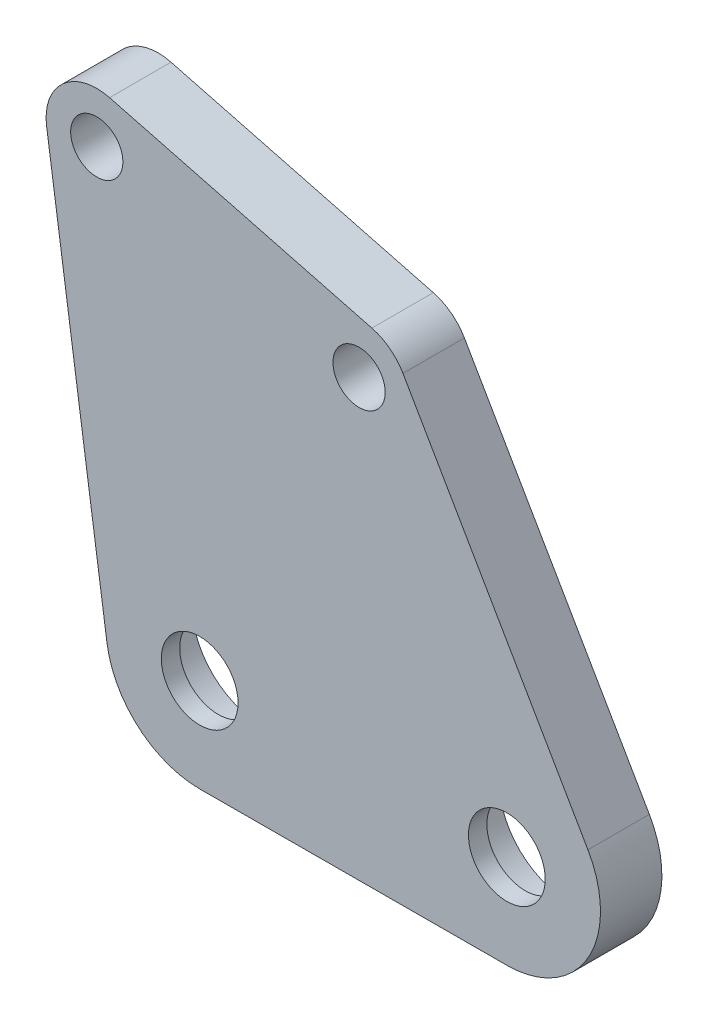
ISO-10303-21;
HEADER;
FILE_DESCRIPTION(('STEP AP214'),'2;1');
FILE_NAME('part.step','',(''),(''),'','','');
FILE_SCHEMA(('AUTOMOTIVE_DESIGN { 1 0 10303 214 1 1 1 1 }'));
ENDSEC;
DATA;
#1=APPLICATION_CONTEXT('core data for automotive mechanical design processes');
#2=APPLICATION_PROTOCOL_DEFINITION('international standard','automotive_design',2000,#1);
#3=PRODUCT_CONTEXT('',#1,'mechanical');
#4=PRODUCT('Part','Part','',(#3));
#5=PRODUCT_RELATED_PRODUCT_CATEGORY('part','',(#4));
#6=PRODUCT_DEFINITION_FORMATION('','',#4);
#7=PRODUCT_DEFINITION_CONTEXT('part definition',#1,'design');
#8=PRODUCT_DEFINITION('design','',#6,#7);
#9=PRODUCT_DEFINITION_SHAPE('','',#8);
#10=(LENGTH_UNIT() NAMED_UNIT(*) SI_UNIT(.MILLI.,.METRE.));
#11=(NAMED_UNIT(*) PLANE_ANGLE_UNIT() SI_UNIT($,.RADIAN.));
#12=(NAMED_UNIT(*) SI_UNIT($,.STERADIAN.) SOLID_ANGLE_UNIT());
#13=UNCERTAINTY_MEASURE_WITH_UNIT(LENGTH_MEASURE(1.E-05),#10,'distance_accuracy_value','');
#14=(GEOMETRIC_REPRESENTATION_CONTEXT(3) GLOBAL_UNCERTAINTY_ASSIGNED_CONTEXT((#13)) GLOBAL_UNIT_ASSIGNED_CONTEXT((#10,
#11,#12)) REPRESENTATION_CONTEXT('',''));
#15=CARTESIAN_POINT('',(0.,0.,0.));
#16=DIRECTION('',(0.,0.,1.));
#17=DIRECTION('',(1.,0.,0.));
#18=AXIS2_PLACEMENT_3D('',#15,#16,#17);
#19=CARTESIAN_POINT('',(-2.67855934400902,-10.2669661090581,10.));
#20=DIRECTION('',(0.252441341619206,0.967612199717167,0.));
#21=DIRECTION('',(-0.967612199717167,0.252441341619206,0.));
#22=AXIS2_PLACEMENT_3D('',#19,#20,#21);
#23=PLANE('',#22);
#24=DIRECTION('',(0.967612199717167,-0.252441341619206,0.));
#25=VECTOR('',#24,1.);
#26=CARTESIAN_POINT('',(-2.67855934400902,-10.2669661090581,0.));
#27=LINE('',#26,#25);
#28=CARTESIAN_POINT('',(22.0592937142197,-16.720850027247,0.));
#29=VERTEX_POINT('',#28);
#30=CARTESIAN_POINT('',(64.7586161350334,-27.8607201542379,0.));
#31=VERTEX_POINT('',#30);
#32=EDGE_CURVE('E144',#29,#31,#27,.T.);
#33=ORIENTED_EDGE('',*,*,#32,.F.);
#34=DIRECTION('',(0.,0.,-1.));
#35=VECTOR('',#34,1.);
#36=CARTESIAN_POINT('',(22.0592937142197,-16.720850027247,10.));
#37=LINE('',#36,#35);
#38=CARTESIAN_POINT('',(22.0592937142197,-16.720850027247,10.));
#39=VERTEX_POINT('',#38);
#40=EDGE_CURVE('E11',#39,#29,#37,.T.);
#41=ORIENTED_EDGE('',*,*,#40,.F.);
#42=DIRECTION('',(0.967612199717167,-0.252441341619206,0.));
#43=VECTOR('',#42,1.);
#44=CARTESIAN_POINT('',(-2.67855934400902,-10.2669661090581,10.));
#45=LINE('',#44,#43);
#46=CARTESIAN_POINT('',(64.7586161350334,-27.8607201542379,10.));
#47=VERTEX_POINT('',#46);
#48=EDGE_CURVE('E170',#39,#47,#45,.T.);
#49=ORIENTED_EDGE('',*,*,#48,.T.);
#50=DIRECTION('',(0.,0.,-1.));
#51=VECTOR('',#50,1.);
#52=CARTESIAN_POINT('',(64.7586161350334,-27.8607201542379,10.));
#53=LINE('',#52,#51);
#54=EDGE_CURVE('E88',#47,#31,#53,.T.);
#55=ORIENTED_EDGE('',*,*,#54,.T.);
#56=EDGE_LOOP('',(#33,#41,#49,#55));
#57=FACE_BOUND('',#56,.T.);
#58=ADVANCED_FACE('F36',(#57),#23,.T.);
#59=CARTESIAN_POINT('',(19.9766526458613,-24.7036506749136,10.));
#60=DIRECTION('',(0.,0.,-1.));
#61=DIRECTION('',(-1.,0.,0.));
#62=AXIS2_PLACEMENT_3D('',#59,#60,#61);
#63=CYLINDRICAL_SURFACE('',#62,8.25);
#64=CARTESIAN_POINT('',(19.9766526458613,-24.7036506749136,0.));
#65=DIRECTION('',(0.,0.,1.));
#66=DIRECTION('',(1.,0.,0.));
#67=AXIS2_PLACEMENT_3D('',#64,#65,#66);
#68=CIRCLE('',#67,8.25);
#69=CARTESIAN_POINT('',(11.811660920216,-25.8849254609581,0.));
#70=VERTEX_POINT('',#69);
#71=EDGE_CURVE('E147',#29,#70,#68,.T.);
#72=ORIENTED_EDGE('',*,*,#71,.T.);
#73=DIRECTION('',(0.,0.,-1.));
#74=VECTOR('',#73,1.);
#75=CARTESIAN_POINT('',(11.811660920216,-25.8849254609581,10.));
#76=LINE('',#75,#74);
#77=CARTESIAN_POINT('',(11.811660920216,-25.8849254609581,10.));
#78=VERTEX_POINT('',#77);
#79=EDGE_CURVE('E45',#78,#70,#76,.T.);
#80=ORIENTED_EDGE('',*,*,#79,.F.);
#81=CARTESIAN_POINT('',(19.9766526458613,-24.7036506749136,10.));
#82=DIRECTION('',(0.,0.,1.));
#83=DIRECTION('',(1.,0.,0.));
#84=AXIS2_PLACEMENT_3D('',#81,#82,#83);
#85=CIRCLE('',#84,8.25);
#86=EDGE_CURVE('E199',#39,#78,#85,.T.);
#87=ORIENTED_EDGE('',*,*,#86,.F.);
#88=ORIENTED_EDGE('',*,*,#40,.T.);
#89=EDGE_LOOP('',(#72,#80,#87,#88));
#90=FACE_BOUND('',#89,.T.);
#91=ADVANCED_FACE('F218',(#90),#63,.T.);
#92=CARTESIAN_POINT('',(7.90136117987293,1.14313388804774,10.));
#93=DIRECTION('',(-0.98969596674488,-0.143184822550845,0.));
#94=DIRECTION('',(0.143184822550845,-0.98969596674488,0.));
#95=AXIS2_PLACEMENT_3D('',#92,#93,#94);
#96=PLANE('',#95);
#97=DIRECTION('',(-0.143184822550845,0.98969596674488,0.));
#98=VECTOR('',#97,1.);
#99=CARTESIAN_POINT('',(7.90136117987293,1.14313388804774,0.));
#100=LINE('',#99,#98);
#101=CARTESIAN_POINT('',(21.6339845286062,-93.7769959060279,0.));
#102=VERTEX_POINT('',#101);
#103=EDGE_CURVE('E150',#102,#70,#100,.T.);
#104=ORIENTED_EDGE('',*,*,#103,.F.);
#105=DIRECTION('',(0.,0.,-1.));
#106=VECTOR('',#105,1.);
#107=CARTESIAN_POINT('',(21.6339845286062,-93.7769959060279,10.));
#108=LINE('',#107,#106);
#109=CARTESIAN_POINT('',(21.6339845286062,-93.7769959060279,10.));
#110=VERTEX_POINT('',#109);
#111=EDGE_CURVE('E176',#110,#102,#108,.T.);
#112=ORIENTED_EDGE('',*,*,#111,.F.);
#113=DIRECTION('',(-0.143184822550845,0.98969596674488,0.));
#114=VECTOR('',#113,1.);
#115=CARTESIAN_POINT('',(7.90136117987293,1.14313388804774,10.));
#116=LINE('',#115,#114);
#117=EDGE_CURVE('E201',#110,#78,#116,.T.);
#118=ORIENTED_EDGE('',*,*,#117,.T.);
#119=ORIENTED_EDGE('',*,*,#79,.T.);
#120=EDGE_LOOP('',(#104,#112,#118,#119));
#121=FACE_BOUND('',#120,.T.);
#122=ADVANCED_FACE('F221',(#121),#96,.T.);
#123=CARTESIAN_POINT('',(36.7268480214656,-91.5934273621275,10.));
#124=DIRECTION('',(0.,0.,-1.));
#125=DIRECTION('',(-1.,0.,0.));
#126=AXIS2_PLACEMENT_3D('',#123,#124,#125);
#127=CYLINDRICAL_SURFACE('',#126,15.25);
#128=CARTESIAN_POINT('',(36.7268480214656,-91.5934273621275,0.));
#129=DIRECTION('',(0.,0.,1.));
#130=DIRECTION('',(1.,0.,0.));
#131=AXIS2_PLACEMENT_3D('',#128,#129,#130);
#132=CIRCLE('',#131,15.25);
#133=CARTESIAN_POINT('',(36.769479911066,-106.843367772568,0.));
#134=VERTEX_POINT('',#133);
#135=EDGE_CURVE('E153',#102,#134,#132,.T.);
#136=ORIENTED_EDGE('',*,*,#135,.T.);
#137=DIRECTION('',(0.,0.,-1.));
#138=VECTOR('',#137,1.);
#139=CARTESIAN_POINT('',(36.769479911066,-106.843367772568,10.));
#140=LINE('',#139,#138);
#141=CARTESIAN_POINT('',(36.769479911066,-106.843367772568,10.));
#142=VERTEX_POINT('',#141);
#143=EDGE_CURVE('E174',#142,#134,#140,.T.);
#144=ORIENTED_EDGE('',*,*,#143,.F.);
#145=CARTESIAN_POINT('',(36.7268480214656,-91.5934273621275,10.));
#146=DIRECTION('',(0.,0.,1.));
#147=DIRECTION('',(1.,0.,0.));
#148=AXIS2_PLACEMENT_3D('',#145,#146,#147);
#149=CIRCLE('',#148,15.25);
#150=EDGE_CURVE('E204',#110,#142,#149,.T.);
#151=ORIENTED_EDGE('',*,*,#150,.F.);
#152=ORIENTED_EDGE('',*,*,#111,.T.);
#153=EDGE_LOOP('',(#136,#144,#151,#152));
#154=FACE_BOUND('',#153,.T.);
#155=ADVANCED_FACE('F224',(#154),#127,.T.);
#156=CARTESIAN_POINT('',(0.29897042666258,-106.945322710893,10.));
#157=DIRECTION('',(0.00279553374428754,-0.999996092487908,0.));
#158=DIRECTION('',(0.999996092487908,0.00279553374428754,0.));
#159=AXIS2_PLACEMENT_3D('',#156,#157,#158);
#160=PLANE('',#159);
#161=DIRECTION('',(-0.999996092487908,-0.00279553374428754,0.));
#162=VECTOR('',#161,1.);
#163=CARTESIAN_POINT('',(0.29897042666258,-106.945322710893,0.));
#164=LINE('',#163,#162);
#165=CARTESIAN_POINT('',(86.7692845354614,-106.703591085354,0.));
#166=VERTEX_POINT('',#165);
#167=EDGE_CURVE('E156',#166,#134,#164,.T.);
#168=ORIENTED_EDGE('',*,*,#167,.F.);
#169=DIRECTION('',(0.,0.,-1.));
#170=VECTOR('',#169,1.);
#171=CARTESIAN_POINT('',(86.7692845354614,-106.703591085354,10.));
#172=LINE('',#171,#170);
#173=CARTESIAN_POINT('',(86.7692845354614,-106.703591085354,10.));
#174=VERTEX_POINT('',#173);
#175=EDGE_CURVE('E125',#174,#166,#172,.T.);
#176=ORIENTED_EDGE('',*,*,#175,.F.);
#177=DIRECTION('',(-0.999996092487908,-0.00279553374428754,0.));
#178=VECTOR('',#177,1.);
#179=CARTESIAN_POINT('',(0.29897042666258,-106.945322710893,10.));
#180=LINE('',#179,#178);
#181=EDGE_CURVE('E114',#174,#142,#180,.T.);
#182=ORIENTED_EDGE('',*,*,#181,.T.);
#183=ORIENTED_EDGE('',*,*,#143,.T.);
#184=EDGE_LOOP('',(#168,#176,#182,#183));
#185=FACE_BOUND('',#184,.T.);
#186=ADVANCED_FACE('F207',(#185),#160,.T.);
#187=CARTESIAN_POINT('',(86.7266526458611,-91.4536506749131,10.));
#188=DIRECTION('',(0.,0.,-1.));
#189=DIRECTION('',(-1.,0.,0.));
#190=AXIS2_PLACEMENT_3D('',#187,#188,#189);
#191=CYLINDRICAL_SURFACE('',#190,15.25);
#192=CARTESIAN_POINT('',(86.7266526458611,-91.4536506749131,0.));
#193=DIRECTION('',(0.,0.,1.));
#194=DIRECTION('',(1.,0.,0.));
#195=AXIS2_PLACEMENT_3D('',#192,#193,#194);
#196=CIRCLE('',#195,15.25);
#197=CARTESIAN_POINT('',(99.9305702237822,-83.8235090906785,0.));
#198=VERTEX_POINT('',#197);
#199=EDGE_CURVE('E121',#166,#198,#196,.T.);
#200=ORIENTED_EDGE('',*,*,#199,.T.);
#201=DIRECTION('',(0.,0.,-1.));
#202=VECTOR('',#201,1.);
#203=CARTESIAN_POINT('',(99.9305702237822,-83.8235090906785,10.));
#204=LINE('',#203,#202);
#205=CARTESIAN_POINT('',(99.9305702237822,-83.8235090906785,10.));
#206=VERTEX_POINT('',#205);
#207=EDGE_CURVE('E118',#206,#198,#204,.T.);
#208=ORIENTED_EDGE('',*,*,#207,.F.);
#209=CARTESIAN_POINT('',(86.7266526458611,-91.4536506749131,10.));
#210=DIRECTION('',(0.,0.,1.));
#211=DIRECTION('',(1.,0.,0.));
#212=AXIS2_PLACEMENT_3D('',#209,#210,#211);
#213=CIRCLE('',#212,15.25);
#214=EDGE_CURVE('E107',#174,#206,#213,.T.);
#215=ORIENTED_EDGE('',*,*,#214,.F.);
#216=ORIENTED_EDGE('',*,*,#175,.T.);
#217=EDGE_LOOP('',(#200,#208,#215,#216));
#218=FACE_BOUND('',#217,.T.);
#219=ADVANCED_FACE('F119',(#218),#191,.T.);
#220=CARTESIAN_POINT('',(38.6012727293348,22.3064991521137,10.));
#221=DIRECTION('',(0.865830660847287,0.500337153064562,0.));
#222=DIRECTION('',(-0.500337153064562,0.865830660847287,0.));
#223=AXIS2_PLACEMENT_3D('',#220,#221,#222);
#224=PLANE('',#223);
#225=DIRECTION('',(0.500337153064562,-0.865830660847287,0.));
#226=VECTOR('',#225,1.);
#227=CARTESIAN_POINT('',(38.6012727293348,22.3064991521137,0.));
#228=LINE('',#227,#226);
#229=CARTESIAN_POINT('',(69.8190780186651,-31.7157392891219,0.));
#230=VERTEX_POINT('',#229);
#231=EDGE_CURVE('E160',#230,#198,#228,.T.);
#232=ORIENTED_EDGE('',*,*,#231,.F.);
#233=DIRECTION('',(0.,0.,-1.));
#234=VECTOR('',#233,1.);
#235=CARTESIAN_POINT('',(69.8190780186651,-31.7157392891219,10.));
#236=LINE('',#235,#234);
#237=CARTESIAN_POINT('',(69.8190780186651,-31.7157392891219,10.));
#238=VERTEX_POINT('',#237);
#239=EDGE_CURVE('E81',#238,#230,#236,.T.);
#240=ORIENTED_EDGE('',*,*,#239,.F.);
#241=DIRECTION('',(0.500337153064562,-0.865830660847287,0.));
#242=VECTOR('',#241,1.);
#243=CARTESIAN_POINT('',(38.6012727293348,22.3064991521137,10.));
#244=LINE('',#243,#242);
#245=EDGE_CURVE('E112',#238,#206,#244,.T.);
#246=ORIENTED_EDGE('',*,*,#245,.T.);
#247=ORIENTED_EDGE('',*,*,#207,.T.);
#248=EDGE_LOOP('',(#232,#240,#246,#247));
#249=FACE_BOUND('',#248,.T.);
#250=ADVANCED_FACE('F127',(#249),#224,.T.);
#251=CARTESIAN_POINT('',(86.7266526458611,-91.4536506749131,10.));
#252=DIRECTION('',(0.,0.,-1.));
#253=DIRECTION('',(-1.,0.,0.));
#254=AXIS2_PLACEMENT_3D('',#251,#252,#253);
#255=CYLINDRICAL_SURFACE('',#254,6.24999999999993);
#256=CARTESIAN_POINT('',(86.7266526458611,-91.4536506749131,7.));
#257=DIRECTION('',(0.,0.,1.));
#258=DIRECTION('',(1.,0.,0.));
#259=AXIS2_PLACEMENT_3D('',#256,#257,#258);
#260=CIRCLE('',#259,6.24999999999993);
#261=CARTESIAN_POINT('',(92.976652645861,-91.4536506749131,7.));
#262=VERTEX_POINT('',#261);
#263=EDGE_CURVE('E39',#262,#262,#260,.T.);
#264=ORIENTED_EDGE('',*,*,#263,.F.);
#265=EDGE_LOOP('',(#264));
#266=FACE_BOUND('',#265,.T.);
#267=CARTESIAN_POINT('',(86.7266526458611,-91.4536506749131,10.));
#268=DIRECTION('',(0.,0.,1.));
#269=DIRECTION('',(1.,0.,0.));
#270=AXIS2_PLACEMENT_3D('',#267,#268,#269);
#271=CIRCLE('',#270,6.24999999999993);
#272=CARTESIAN_POINT('',(92.976652645861,-91.4536506749131,10.));
#273=VERTEX_POINT('',#272);
#274=EDGE_CURVE('E138',#273,#273,#271,.T.);
#275=ORIENTED_EDGE('',*,*,#274,.T.);
#276=EDGE_LOOP('',(#275));
#277=FACE_BOUND('',#276,.T.);
#278=ADVANCED_FACE('F270',(#266,#277),#255,.F.);
#279=CARTESIAN_POINT('',(19.9766526458613,-24.7036506749136,10.));
#280=DIRECTION('',(0.,0.,-1.));
#281=DIRECTION('',(-1.,0.,0.));
#282=AXIS2_PLACEMENT_3D('',#279,#280,#281);
#283=CYLINDRICAL_SURFACE('',#282,4.25);
#284=CARTESIAN_POINT('',(19.9766526458613,-24.7036506749136,10.));
#285=DIRECTION('',(0.,0.,1.));
#286=DIRECTION('',(1.,0.,0.));
#287=AXIS2_PLACEMENT_3D('',#284,#285,#286);
#288=CIRCLE('',#287,4.25);
#289=CARTESIAN_POINT('',(24.2266526458613,-24.7036506749136,10.));
#290=VERTEX_POINT('',#289);
#291=EDGE_CURVE('E135',#290,#290,#288,.T.);
#292=ORIENTED_EDGE('',*,*,#291,.T.);
#293=EDGE_LOOP('',(#292));
#294=FACE_BOUND('',#293,.T.);
#295=CARTESIAN_POINT('',(19.9766526458613,-24.7036506749136,0.));
#296=DIRECTION('',(0.,0.,1.));
#297=DIRECTION('',(1.,0.,0.));
#298=AXIS2_PLACEMENT_3D('',#295,#296,#297);
#299=CIRCLE('',#298,4.25);
#300=CARTESIAN_POINT('',(24.2266526458613,-24.7036506749136,0.));
#301=VERTEX_POINT('',#300);
#302=EDGE_CURVE('E167',#301,#301,#299,.T.);
#303=ORIENTED_EDGE('',*,*,#302,.F.);
#304=EDGE_LOOP('',(#303));
#305=FACE_BOUND('',#304,.T.);
#306=ADVANCED_FACE('F277',(#294,#305),#283,.F.);
#307=CARTESIAN_POINT('',(62.675975066675,-35.8435208019046,10.));
#308=DIRECTION('',(0.,0.,-1.));
#309=DIRECTION('',(-1.,0.,0.));
#310=AXIS2_PLACEMENT_3D('',#307,#308,#309);
#311=CYLINDRICAL_SURFACE('',#310,4.25000000000001);
#312=CARTESIAN_POINT('',(62.675975066675,-35.8435208019046,10.));
#313=DIRECTION('',(0.,0.,1.));
#314=DIRECTION('',(1.,0.,0.));
#315=AXIS2_PLACEMENT_3D('',#312,#313,#314);
#316=CIRCLE('',#315,4.25000000000001);
#317=CARTESIAN_POINT('',(66.925975066675,-35.8435208019046,10.));
#318=VERTEX_POINT('',#317);
#319=EDGE_CURVE('E129',#318,#318,#316,.T.);
#320=ORIENTED_EDGE('',*,*,#319,.T.);
#321=EDGE_LOOP('',(#320));
#322=FACE_BOUND('',#321,.T.);
#323=CARTESIAN_POINT('',(62.675975066675,-35.8435208019046,0.));
#324=DIRECTION('',(0.,0.,1.));
#325=DIRECTION('',(1.,0.,0.));
#326=AXIS2_PLACEMENT_3D('',#323,#324,#325);
#327=CIRCLE('',#326,4.25000000000001);
#328=CARTESIAN_POINT('',(66.925975066675,-35.8435208019046,0.));
#329=VERTEX_POINT('',#328);
#330=EDGE_CURVE('E164',#329,#329,#327,.T.);
#331=ORIENTED_EDGE('',*,*,#330,.F.);
#332=EDGE_LOOP('',(#331));
#333=FACE_BOUND('',#332,.T.);
#334=ADVANCED_FACE('F282',(#322,#333),#311,.F.);
#335=CARTESIAN_POINT('',(62.675975066675,-35.8435208019046,10.));
#336=DIRECTION('',(0.,0.,-1.));
#337=DIRECTION('',(-1.,0.,0.));
#338=AXIS2_PLACEMENT_3D('',#335,#336,#337);
#339=CYLINDRICAL_SURFACE('',#338,8.25000000000001);
#340=CARTESIAN_POINT('',(62.675975066675,-35.8435208019046,0.));
#341=DIRECTION('',(0.,0.,1.));
#342=DIRECTION('',(1.,0.,0.));
#343=AXIS2_PLACEMENT_3D('',#340,#341,#342);
#344=CIRCLE('',#343,8.25000000000001);
#345=EDGE_CURVE('E162',#230,#31,#344,.T.);
#346=ORIENTED_EDGE('',*,*,#345,.T.);
#347=ORIENTED_EDGE('',*,*,#54,.F.);
#348=CARTESIAN_POINT('',(62.675975066675,-35.8435208019046,10.));
#349=DIRECTION('',(0.,0.,1.));
#350=DIRECTION('',(1.,0.,0.));
#351=AXIS2_PLACEMENT_3D('',#348,#349,#350);
#352=CIRCLE('',#351,8.25000000000001);
#353=EDGE_CURVE('E54',#238,#47,#352,.T.);
#354=ORIENTED_EDGE('',*,*,#353,.F.);
#355=ORIENTED_EDGE('',*,*,#239,.T.);
#356=EDGE_LOOP('',(#346,#347,#354,#355));
#357=FACE_BOUND('',#356,.T.);
#358=ADVANCED_FACE('F214',(#357),#339,.T.);
#359=CARTESIAN_POINT('',(36.7268480214656,-91.5934273621275,10.));
#360=DIRECTION('',(0.,0.,-1.));
#361=DIRECTION('',(-1.,0.,0.));
#362=AXIS2_PLACEMENT_3D('',#359,#360,#361);
#363=CYLINDRICAL_SURFACE('',#362,6.24999999999993);
#364=CARTESIAN_POINT('',(36.7268480214656,-91.5934273621275,7.));
#365=DIRECTION('',(0.,0.,1.));
#366=DIRECTION('',(1.,0.,0.));
#367=AXIS2_PLACEMENT_3D('',#364,#365,#366);
#368=CIRCLE('',#367,6.24999999999993);
#369=CARTESIAN_POINT('',(42.9768480214656,-91.5934273621275,7.));
#370=VERTEX_POINT('',#369);
#371=EDGE_CURVE('E178',#370,#370,#368,.T.);
#372=ORIENTED_EDGE('',*,*,#371,.F.);
#373=EDGE_LOOP('',(#372));
#374=FACE_BOUND('',#373,.T.);
#375=CARTESIAN_POINT('',(36.7268480214656,-91.5934273621275,10.));
#376=DIRECTION('',(0.,0.,1.));
#377=DIRECTION('',(1.,0.,0.));
#378=AXIS2_PLACEMENT_3D('',#375,#376,#377);
#379=CIRCLE('',#378,6.24999999999993);
#380=CARTESIAN_POINT('',(42.9768480214656,-91.5934273621275,10.));
#381=VERTEX_POINT('',#380);
#382=EDGE_CURVE('E141',#381,#381,#379,.T.);
#383=ORIENTED_EDGE('',*,*,#382,.T.);
#384=EDGE_LOOP('',(#383));
#385=FACE_BOUND('',#384,.T.);
#386=ADVANCED_FACE('F301',(#374,#385),#363,.F.);
#387=CARTESIAN_POINT('',(0.,0.,10.));
#388=DIRECTION('',(0.,0.,1.));
#389=DIRECTION('',(1.,0.,0.));
#390=AXIS2_PLACEMENT_3D('',#387,#388,#389);
#391=PLANE('',#390);
#392=ORIENTED_EDGE('',*,*,#48,.F.);
#393=ORIENTED_EDGE('',*,*,#86,.T.);
#394=ORIENTED_EDGE('',*,*,#117,.F.);
#395=ORIENTED_EDGE('',*,*,#150,.T.);
#396=ORIENTED_EDGE('',*,*,#181,.F.);
#397=ORIENTED_EDGE('',*,*,#214,.T.);
#398=ORIENTED_EDGE('',*,*,#245,.F.);
#399=ORIENTED_EDGE('',*,*,#353,.T.);
#400=EDGE_LOOP('',(#392,#393,#394,#395,#396,#397,#398,#399));
#401=FACE_BOUND('',#400,.T.);
#402=ORIENTED_EDGE('',*,*,#319,.F.);
#403=EDGE_LOOP('',(#402));
#404=FACE_BOUND('',#403,.T.);
#405=ORIENTED_EDGE('',*,*,#291,.F.);
#406=EDGE_LOOP('',(#405));
#407=FACE_BOUND('',#406,.T.);
#408=ORIENTED_EDGE('',*,*,#274,.F.);
#409=EDGE_LOOP('',(#408));
#410=FACE_BOUND('',#409,.T.);
#411=ORIENTED_EDGE('',*,*,#382,.F.);
#412=EDGE_LOOP('',(#411));
#413=FACE_BOUND('',#412,.T.);
#414=ADVANCED_FACE('F109',(#401,#404,#407,#410,#413),#391,.T.);
#415=CARTESIAN_POINT('',(0.,0.,0.));
#416=DIRECTION('',(0.,0.,1.));
#417=DIRECTION('',(1.,0.,0.));
#418=AXIS2_PLACEMENT_3D('',#415,#416,#417);
#419=PLANE('',#418);
#420=CARTESIAN_POINT('',(36.7268480214656,-91.5934273621275,0.));
#421=DIRECTION('',(0.,0.,1.));
#422=DIRECTION('',(1.,0.,0.));
#423=AXIS2_PLACEMENT_3D('',#420,#421,#422);
#424=CIRCLE('',#423,11.25);
#425=CARTESIAN_POINT('',(47.9768480214656,-91.5934273621275,0.));
#426=VERTEX_POINT('',#425);
#427=EDGE_CURVE('E185',#426,#426,#424,.T.);
#428=ORIENTED_EDGE('',*,*,#427,.T.);
#429=EDGE_LOOP('',(#428));
#430=FACE_BOUND('',#429,.T.);
#431=CARTESIAN_POINT('',(86.7266526458611,-91.4536506749131,0.));
#432=DIRECTION('',(0.,0.,1.));
#433=DIRECTION('',(1.,0.,0.));
#434=AXIS2_PLACEMENT_3D('',#431,#432,#433);
#435=CIRCLE('',#434,11.25);
#436=CARTESIAN_POINT('',(97.976652645861,-91.4536506749131,0.));
#437=VERTEX_POINT('',#436);
#438=EDGE_CURVE('E190',#437,#437,#435,.T.);
#439=ORIENTED_EDGE('',*,*,#438,.T.);
#440=EDGE_LOOP('',(#439));
#441=FACE_BOUND('',#440,.T.);
#442=ORIENTED_EDGE('',*,*,#32,.T.);
#443=ORIENTED_EDGE('',*,*,#345,.F.);
#444=ORIENTED_EDGE('',*,*,#231,.T.);
#445=ORIENTED_EDGE('',*,*,#199,.F.);
#446=ORIENTED_EDGE('',*,*,#167,.T.);
#447=ORIENTED_EDGE('',*,*,#135,.F.);
#448=ORIENTED_EDGE('',*,*,#103,.T.);
#449=ORIENTED_EDGE('',*,*,#71,.F.);
#450=EDGE_LOOP('',(#442,#443,#444,#445,#446,#447,#448,#449));
#451=FACE_BOUND('',#450,.T.);
#452=ORIENTED_EDGE('',*,*,#330,.T.);
#453=EDGE_LOOP('',(#452));
#454=FACE_BOUND('',#453,.T.);
#455=ORIENTED_EDGE('',*,*,#302,.T.);
#456=EDGE_LOOP('',(#455));
#457=FACE_BOUND('',#456,.T.);
#458=ADVANCED_FACE('F210',(#430,#441,#451,#454,#457),#419,.F.);
#459=CARTESIAN_POINT('',(86.7266526458611,-91.4536506749131,7.));
#460=DIRECTION('',(0.,0.,-1.));
#461=DIRECTION('',(-1.,0.,0.));
#462=AXIS2_PLACEMENT_3D('',#459,#460,#461);
#463=CYLINDRICAL_SURFACE('',#462,11.25);
#464=CARTESIAN_POINT('',(86.7266526458611,-91.4536506749131,7.));
#465=DIRECTION('',(0.,0.,1.));
#466=DIRECTION('',(1.,0.,0.));
#467=AXIS2_PLACEMENT_3D('',#464,#465,#466);
#468=CIRCLE('',#467,11.25);
#469=CARTESIAN_POINT('',(97.976652645861,-91.4536506749131,7.));
#470=VERTEX_POINT('',#469);
#471=EDGE_CURVE('E195',#470,#470,#468,.T.);
#472=ORIENTED_EDGE('',*,*,#471,.T.);
#473=EDGE_LOOP('',(#472));
#474=FACE_BOUND('',#473,.T.);
#475=ORIENTED_EDGE('',*,*,#438,.F.);
#476=EDGE_LOOP('',(#475));
#477=FACE_BOUND('',#476,.T.);
#478=ADVANCED_FACE('F337',(#474,#477),#463,.F.);
#479=CARTESIAN_POINT('',(86.7266526458611,-91.4536506749131,7.));
#480=DIRECTION('',(0.,0.,1.));
#481=DIRECTION('',(1.,0.,0.));
#482=AXIS2_PLACEMENT_3D('',#479,#480,#481);
#483=PLANE('',#482);
#484=ORIENTED_EDGE('',*,*,#263,.T.);
#485=EDGE_LOOP('',(#484));
#486=FACE_BOUND('',#485,.T.);
#487=ORIENTED_EDGE('',*,*,#471,.F.);
#488=EDGE_LOOP('',(#487));
#489=FACE_BOUND('',#488,.T.);
#490=ADVANCED_FACE('F348',(#486,#489),#483,.F.);
#491=CARTESIAN_POINT('',(36.7268480214656,-91.5934273621275,7.));
#492=DIRECTION('',(0.,0.,-1.));
#493=DIRECTION('',(-1.,0.,0.));
#494=AXIS2_PLACEMENT_3D('',#491,#492,#493);
#495=CYLINDRICAL_SURFACE('',#494,11.25);
#496=CARTESIAN_POINT('',(36.7268480214656,-91.5934273621275,7.));
#497=DIRECTION('',(0.,0.,1.));
#498=DIRECTION('',(1.,0.,0.));
#499=AXIS2_PLACEMENT_3D('',#496,#497,#498);
#500=CIRCLE('',#499,11.25);
#501=CARTESIAN_POINT('',(47.9768480214656,-91.5934273621275,7.));
#502=VERTEX_POINT('',#501);
#503=EDGE_CURVE('E180',#502,#502,#500,.T.);
#504=ORIENTED_EDGE('',*,*,#503,.T.);
#505=EDGE_LOOP('',(#504));
#506=FACE_BOUND('',#505,.T.);
#507=ORIENTED_EDGE('',*,*,#427,.F.);
#508=EDGE_LOOP('',(#507));
#509=FACE_BOUND('',#508,.T.);
#510=ADVANCED_FACE('F358',(#506,#509),#495,.F.);
#511=CARTESIAN_POINT('',(36.7268480214656,-91.5934273621275,7.));
#512=DIRECTION('',(0.,0.,1.));
#513=DIRECTION('',(1.,0.,0.));
#514=AXIS2_PLACEMENT_3D('',#511,#512,#513);
#515=PLANE('',#514);
#516=ORIENTED_EDGE('',*,*,#371,.T.);
#517=EDGE_LOOP('',(#516));
#518=FACE_BOUND('',#517,.T.);
#519=ORIENTED_EDGE('',*,*,#503,.F.);
#520=EDGE_LOOP('',(#519));
#521=FACE_BOUND('',#520,.T.);
#522=ADVANCED_FACE('F368',(#518,#521),#515,.F.);
#523=CLOSED_SHELL('',(#58,#91,#122,#155,#186,#219,#250,#278,#306,#334,#358,#386,#414,#458,#478,
#490,#510,#522));
#524=MANIFOLD_SOLID_BREP('B2',#523);
#525=ADVANCED_BREP_SHAPE_REPRESENTATION('',(#18,#524),#14);
#526=SHAPE_DEFINITION_REPRESENTATION(#9,#525);
ENDSEC;
END-ISO-10303-21;
